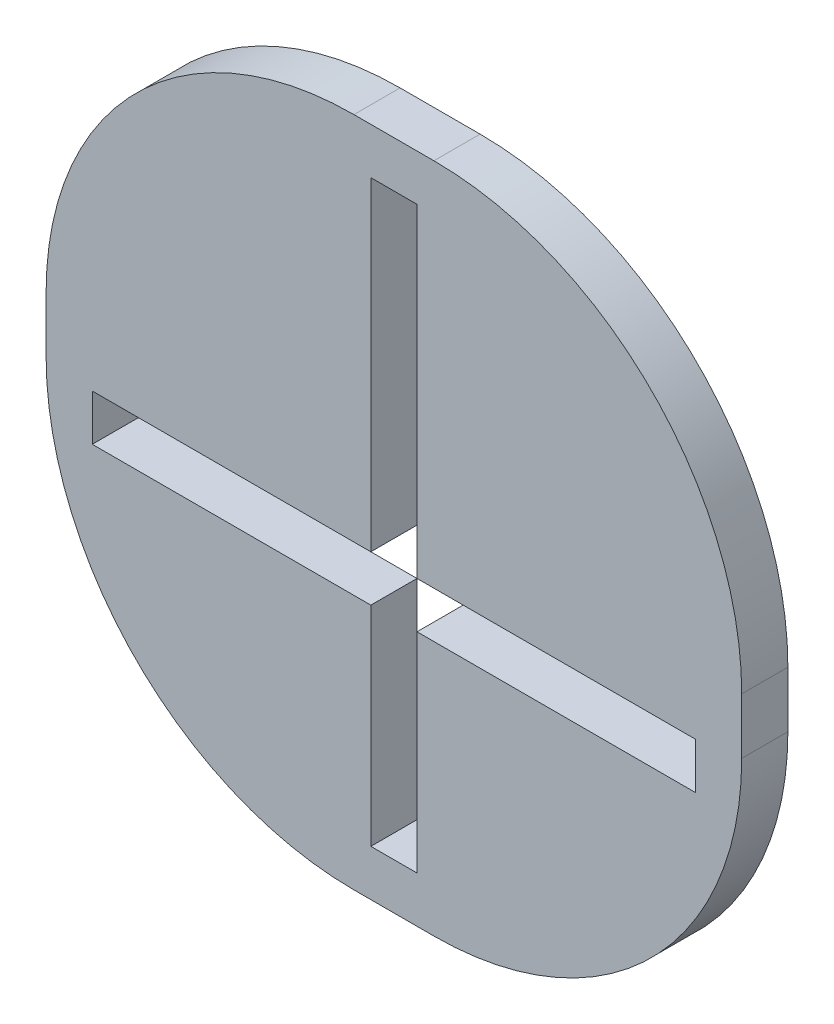
ISO-10303-21;
HEADER;
FILE_DESCRIPTION(('STEP AP214'),'2;1');
FILE_NAME('part.step','',(''),(''),'','','');
FILE_SCHEMA(('AUTOMOTIVE_DESIGN { 1 0 10303 214 1 1 1 1 }'));
ENDSEC;
DATA;
#1=APPLICATION_CONTEXT('core data for automotive mechanical design processes');
#2=APPLICATION_PROTOCOL_DEFINITION('international standard','automotive_design',2000,#1);
#3=PRODUCT_CONTEXT('',#1,'mechanical');
#4=PRODUCT('Part','Part','',(#3));
#5=PRODUCT_RELATED_PRODUCT_CATEGORY('part','',(#4));
#6=PRODUCT_DEFINITION_FORMATION('','',#4);
#7=PRODUCT_DEFINITION_CONTEXT('part definition',#1,'design');
#8=PRODUCT_DEFINITION('design','',#6,#7);
#9=PRODUCT_DEFINITION_SHAPE('','',#8);
#10=(LENGTH_UNIT() NAMED_UNIT(*) SI_UNIT(.MILLI.,.METRE.));
#11=(NAMED_UNIT(*) PLANE_ANGLE_UNIT() SI_UNIT($,.RADIAN.));
#12=(NAMED_UNIT(*) SI_UNIT($,.STERADIAN.) SOLID_ANGLE_UNIT());
#13=UNCERTAINTY_MEASURE_WITH_UNIT(LENGTH_MEASURE(1.E-05),#10,'distance_accuracy_value','');
#14=(GEOMETRIC_REPRESENTATION_CONTEXT(3) GLOBAL_UNCERTAINTY_ASSIGNED_CONTEXT((#13)) GLOBAL_UNIT_ASSIGNED_CONTEXT((#10,
#11,#12)) REPRESENTATION_CONTEXT('',''));
#15=CARTESIAN_POINT('',(0.,0.,0.));
#16=DIRECTION('',(0.,0.,1.));
#17=DIRECTION('',(1.,0.,0.));
#18=AXIS2_PLACEMENT_3D('',#15,#16,#17);
#19=CARTESIAN_POINT('',(0.,21.815,3.));
#20=DIRECTION('',(0.,-1.,0.));
#21=DIRECTION('',(0.,0.,-1.));
#22=AXIS2_PLACEMENT_3D('',#19,#20,#21);
#23=PLANE('',#22);
#24=DIRECTION('',(-1.,0.,0.));
#25=VECTOR('',#24,1.);
#26=CARTESIAN_POINT('',(0.,21.815,0.));
#27=LINE('',#26,#25);
#28=CARTESIAN_POINT('',(2.6,21.815,0.));
#29=VERTEX_POINT('',#28);
#30=CARTESIAN_POINT('',(-2.60000000000002,21.815,0.));
#31=VERTEX_POINT('',#30);
#32=EDGE_CURVE('E254',#29,#31,#27,.T.);
#33=ORIENTED_EDGE('',*,*,#32,.T.);
#34=DIRECTION('',(0.,0.,-1.));
#35=VECTOR('',#34,1.);
#36=CARTESIAN_POINT('',(-2.60000000000002,21.815,3.));
#37=LINE('',#36,#35);
#38=CARTESIAN_POINT('',(-2.60000000000002,21.815,3.));
#39=VERTEX_POINT('',#38);
#40=EDGE_CURVE('E11',#39,#31,#37,.T.);
#41=ORIENTED_EDGE('',*,*,#40,.F.);
#42=DIRECTION('',(-1.,0.,0.));
#43=VECTOR('',#42,1.);
#44=CARTESIAN_POINT('',(0.,21.815,3.));
#45=LINE('',#44,#43);
#46=CARTESIAN_POINT('',(2.6,21.815,3.));
#47=VERTEX_POINT('',#46);
#48=EDGE_CURVE('E405',#47,#39,#45,.T.);
#49=ORIENTED_EDGE('',*,*,#48,.F.);
#50=DIRECTION('',(0.,0.,-1.));
#51=VECTOR('',#50,1.);
#52=CARTESIAN_POINT('',(2.6,21.815,3.));
#53=LINE('',#52,#51);
#54=EDGE_CURVE('E281',#47,#29,#53,.T.);
#55=ORIENTED_EDGE('',*,*,#54,.T.);
#56=EDGE_LOOP('',(#33,#41,#49,#55));
#57=FACE_BOUND('',#56,.T.);
#58=ADVANCED_FACE('F45',(#57),#23,.F.);
#59=CARTESIAN_POINT('',(-2.60000000000002,1.81500000000003,3.));
#60=DIRECTION('',(0.,0.,-1.));
#61=DIRECTION('',(-1.,0.,0.));
#62=AXIS2_PLACEMENT_3D('',#59,#60,#61);
#63=CYLINDRICAL_SURFACE('',#62,20.);
#64=CARTESIAN_POINT('',(-2.60000000000002,1.81500000000003,0.));
#65=DIRECTION('',(0.,0.,1.));
#66=DIRECTION('',(1.,0.,0.));
#67=AXIS2_PLACEMENT_3D('',#64,#65,#66);
#68=CIRCLE('',#67,20.);
#69=CARTESIAN_POINT('',(-22.6,1.81500000000002,0.));
#70=VERTEX_POINT('',#69);
#71=EDGE_CURVE('E258',#31,#70,#68,.T.);
#72=ORIENTED_EDGE('',*,*,#71,.T.);
#73=DIRECTION('',(0.,0.,-1.));
#74=VECTOR('',#73,1.);
#75=CARTESIAN_POINT('',(-22.6,1.81500000000002,3.));
#76=LINE('',#75,#74);
#77=CARTESIAN_POINT('',(-22.6,1.81500000000002,3.));
#78=VERTEX_POINT('',#77);
#79=EDGE_CURVE('E56',#78,#70,#76,.T.);
#80=ORIENTED_EDGE('',*,*,#79,.F.);
#81=CARTESIAN_POINT('',(-2.60000000000002,1.81500000000003,3.));
#82=DIRECTION('',(0.,0.,1.));
#83=DIRECTION('',(1.,0.,0.));
#84=AXIS2_PLACEMENT_3D('',#81,#82,#83);
#85=CIRCLE('',#84,20.);
#86=EDGE_CURVE('E408',#39,#78,#85,.T.);
#87=ORIENTED_EDGE('',*,*,#86,.F.);
#88=ORIENTED_EDGE('',*,*,#40,.T.);
#89=EDGE_LOOP('',(#72,#80,#87,#88));
#90=FACE_BOUND('',#89,.T.);
#91=ADVANCED_FACE('F440',(#90),#63,.T.);
#92=CARTESIAN_POINT('',(-22.6,0.,3.));
#93=DIRECTION('',(-1.,0.,0.));
#94=DIRECTION('',(0.,0.,1.));
#95=AXIS2_PLACEMENT_3D('',#92,#93,#94);
#96=PLANE('',#95);
#97=DIRECTION('',(0.,1.,0.));
#98=VECTOR('',#97,1.);
#99=CARTESIAN_POINT('',(-22.6,0.,0.));
#100=LINE('',#99,#98);
#101=CARTESIAN_POINT('',(-22.6,-1.81500000000002,0.));
#102=VERTEX_POINT('',#101);
#103=EDGE_CURVE('E262',#102,#70,#100,.T.);
#104=ORIENTED_EDGE('',*,*,#103,.F.);
#105=DIRECTION('',(0.,0.,-1.));
#106=VECTOR('',#105,1.);
#107=CARTESIAN_POINT('',(-22.6,-1.81500000000002,3.));
#108=LINE('',#107,#106);
#109=CARTESIAN_POINT('',(-22.6,-1.81500000000002,3.));
#110=VERTEX_POINT('',#109);
#111=EDGE_CURVE('E291',#110,#102,#108,.T.);
#112=ORIENTED_EDGE('',*,*,#111,.F.);
#113=DIRECTION('',(0.,1.,0.));
#114=VECTOR('',#113,1.);
#115=CARTESIAN_POINT('',(-22.6,0.,3.));
#116=LINE('',#115,#114);
#117=EDGE_CURVE('E411',#110,#78,#116,.T.);
#118=ORIENTED_EDGE('',*,*,#117,.T.);
#119=ORIENTED_EDGE('',*,*,#79,.T.);
#120=EDGE_LOOP('',(#104,#112,#118,#119));
#121=FACE_BOUND('',#120,.T.);
#122=ADVANCED_FACE('F445',(#121),#96,.T.);
#123=CARTESIAN_POINT('',(-2.60000000000002,-1.81500000000001,3.));
#124=DIRECTION('',(0.,0.,-1.));
#125=DIRECTION('',(-1.,0.,0.));
#126=AXIS2_PLACEMENT_3D('',#123,#124,#125);
#127=CYLINDRICAL_SURFACE('',#126,20.);
#128=CARTESIAN_POINT('',(-2.60000000000002,-1.81500000000001,0.));
#129=DIRECTION('',(0.,0.,1.));
#130=DIRECTION('',(1.,0.,0.));
#131=AXIS2_PLACEMENT_3D('',#128,#129,#130);
#132=CIRCLE('',#131,20.);
#133=CARTESIAN_POINT('',(-2.60000000000002,-21.815,0.));
#134=VERTEX_POINT('',#133);
#135=EDGE_CURVE('E266',#134,#102,#132,.F.);
#136=ORIENTED_EDGE('',*,*,#135,.F.);
#137=DIRECTION('',(0.,0.,-1.));
#138=VECTOR('',#137,1.);
#139=CARTESIAN_POINT('',(-2.60000000000002,-21.815,3.));
#140=LINE('',#139,#138);
#141=CARTESIAN_POINT('',(-2.60000000000002,-21.815,3.));
#142=VERTEX_POINT('',#141);
#143=EDGE_CURVE('E288',#142,#134,#140,.T.);
#144=ORIENTED_EDGE('',*,*,#143,.F.);
#145=CARTESIAN_POINT('',(-2.60000000000002,-1.81500000000001,3.));
#146=DIRECTION('',(0.,0.,1.));
#147=DIRECTION('',(1.,0.,0.));
#148=AXIS2_PLACEMENT_3D('',#145,#146,#147);
#149=CIRCLE('',#148,20.);
#150=EDGE_CURVE('E415',#142,#110,#149,.F.);
#151=ORIENTED_EDGE('',*,*,#150,.T.);
#152=ORIENTED_EDGE('',*,*,#111,.T.);
#153=EDGE_LOOP('',(#136,#144,#151,#152));
#154=FACE_BOUND('',#153,.T.);
#155=ADVANCED_FACE('F608',(#154),#127,.T.);
#156=CARTESIAN_POINT('',(0.,-21.815,3.));
#157=DIRECTION('',(0.,-1.,0.));
#158=DIRECTION('',(0.,0.,-1.));
#159=AXIS2_PLACEMENT_3D('',#156,#157,#158);
#160=PLANE('',#159);
#161=DIRECTION('',(-1.,0.,0.));
#162=VECTOR('',#161,1.);
#163=CARTESIAN_POINT('',(0.,-21.815,0.));
#164=LINE('',#163,#162);
#165=CARTESIAN_POINT('',(2.60000000000002,-21.815,0.));
#166=VERTEX_POINT('',#165);
#167=EDGE_CURVE('E270',#166,#134,#164,.T.);
#168=ORIENTED_EDGE('',*,*,#167,.F.);
#169=DIRECTION('',(0.,0.,-1.));
#170=VECTOR('',#169,1.);
#171=CARTESIAN_POINT('',(2.60000000000002,-21.815,3.));
#172=LINE('',#171,#170);
#173=CARTESIAN_POINT('',(2.60000000000002,-21.815,3.));
#174=VERTEX_POINT('',#173);
#175=EDGE_CURVE('E212',#174,#166,#172,.T.);
#176=ORIENTED_EDGE('',*,*,#175,.F.);
#177=DIRECTION('',(-1.,0.,0.));
#178=VECTOR('',#177,1.);
#179=CARTESIAN_POINT('',(0.,-21.815,3.));
#180=LINE('',#179,#178);
#181=EDGE_CURVE('E203',#174,#142,#180,.T.);
#182=ORIENTED_EDGE('',*,*,#181,.T.);
#183=ORIENTED_EDGE('',*,*,#143,.T.);
#184=EDGE_LOOP('',(#168,#176,#182,#183));
#185=FACE_BOUND('',#184,.T.);
#186=ADVANCED_FACE('F421',(#185),#160,.T.);
#187=CARTESIAN_POINT('',(2.6,-1.815,3.));
#188=DIRECTION('',(0.,0.,-1.));
#189=DIRECTION('',(-1.,0.,0.));
#190=AXIS2_PLACEMENT_3D('',#187,#188,#189);
#191=CYLINDRICAL_SURFACE('',#190,20.);
#192=CARTESIAN_POINT('',(2.6,-1.815,0.));
#193=DIRECTION('',(0.,0.,1.));
#194=DIRECTION('',(1.,0.,0.));
#195=AXIS2_PLACEMENT_3D('',#192,#193,#194);
#196=CIRCLE('',#195,20.);
#197=CARTESIAN_POINT('',(22.6,-1.815,0.));
#198=VERTEX_POINT('',#197);
#199=EDGE_CURVE('E210',#166,#198,#196,.T.);
#200=ORIENTED_EDGE('',*,*,#199,.T.);
#201=DIRECTION('',(0.,0.,-1.));
#202=VECTOR('',#201,1.);
#203=CARTESIAN_POINT('',(22.6,-1.815,3.));
#204=LINE('',#203,#202);
#205=CARTESIAN_POINT('',(22.6,-1.815,3.));
#206=VERTEX_POINT('',#205);
#207=EDGE_CURVE('E207',#206,#198,#204,.T.);
#208=ORIENTED_EDGE('',*,*,#207,.F.);
#209=CARTESIAN_POINT('',(2.6,-1.815,3.));
#210=DIRECTION('',(0.,0.,1.));
#211=DIRECTION('',(1.,0.,0.));
#212=AXIS2_PLACEMENT_3D('',#209,#210,#211);
#213=CIRCLE('',#212,20.);
#214=EDGE_CURVE('E196',#174,#206,#213,.T.);
#215=ORIENTED_EDGE('',*,*,#214,.F.);
#216=ORIENTED_EDGE('',*,*,#175,.T.);
#217=EDGE_LOOP('',(#200,#208,#215,#216));
#218=FACE_BOUND('',#217,.T.);
#219=ADVANCED_FACE('F208',(#218),#191,.T.);
#220=CARTESIAN_POINT('',(22.6,0.,3.));
#221=DIRECTION('',(-1.,0.,0.));
#222=DIRECTION('',(0.,0.,1.));
#223=AXIS2_PLACEMENT_3D('',#220,#221,#222);
#224=PLANE('',#223);
#225=DIRECTION('',(0.,1.,0.));
#226=VECTOR('',#225,1.);
#227=CARTESIAN_POINT('',(22.6,0.,0.));
#228=LINE('',#227,#226);
#229=CARTESIAN_POINT('',(22.6,1.81500000000003,0.));
#230=VERTEX_POINT('',#229);
#231=EDGE_CURVE('E130',#198,#230,#228,.T.);
#232=ORIENTED_EDGE('',*,*,#231,.T.);
#233=DIRECTION('',(0.,0.,-1.));
#234=VECTOR('',#233,1.);
#235=CARTESIAN_POINT('',(22.6,1.81500000000003,3.));
#236=LINE('',#235,#234);
#237=CARTESIAN_POINT('',(22.6,1.81500000000003,3.));
#238=VERTEX_POINT('',#237);
#239=EDGE_CURVE('E213',#238,#230,#236,.T.);
#240=ORIENTED_EDGE('',*,*,#239,.F.);
#241=DIRECTION('',(0.,1.,0.));
#242=VECTOR('',#241,1.);
#243=CARTESIAN_POINT('',(22.6,0.,3.));
#244=LINE('',#243,#242);
#245=EDGE_CURVE('E200',#206,#238,#244,.T.);
#246=ORIENTED_EDGE('',*,*,#245,.F.);
#247=ORIENTED_EDGE('',*,*,#207,.T.);
#248=EDGE_LOOP('',(#232,#240,#246,#247));
#249=FACE_BOUND('',#248,.T.);
#250=ADVANCED_FACE('F215',(#249),#224,.F.);
#251=CARTESIAN_POINT('',(0.,18.815,3.));
#252=DIRECTION('',(0.,1.,0.));
#253=DIRECTION('',(0.,0.,1.));
#254=AXIS2_PLACEMENT_3D('',#251,#252,#253);
#255=PLANE('',#254);
#256=DIRECTION('',(1.,0.,0.));
#257=VECTOR('',#256,1.);
#258=CARTESIAN_POINT('',(0.,18.815,0.));
#259=LINE('',#258,#257);
#260=CARTESIAN_POINT('',(-1.5,18.815,0.));
#261=VERTEX_POINT('',#260);
#262=CARTESIAN_POINT('',(1.5,18.815,0.));
#263=VERTEX_POINT('',#262);
#264=EDGE_CURVE('E223',#261,#263,#259,.T.);
#265=ORIENTED_EDGE('',*,*,#264,.T.);
#266=DIRECTION('',(0.,0.,-1.));
#267=VECTOR('',#266,1.);
#268=CARTESIAN_POINT('',(1.5,18.815,3.));
#269=LINE('',#268,#267);
#270=CARTESIAN_POINT('',(1.5,18.815,3.));
#271=VERTEX_POINT('',#270);
#272=EDGE_CURVE('E49',#271,#263,#269,.T.);
#273=ORIENTED_EDGE('',*,*,#272,.F.);
#274=DIRECTION('',(1.,0.,0.));
#275=VECTOR('',#274,1.);
#276=CARTESIAN_POINT('',(0.,18.815,3.));
#277=LINE('',#276,#275);
#278=CARTESIAN_POINT('',(-1.5,18.815,3.));
#279=VERTEX_POINT('',#278);
#280=EDGE_CURVE('E280',#279,#271,#277,.T.);
#281=ORIENTED_EDGE('',*,*,#280,.F.);
#282=DIRECTION('',(0.,0.,-1.));
#283=VECTOR('',#282,1.);
#284=CARTESIAN_POINT('',(-1.5,18.815,3.));
#285=LINE('',#284,#283);
#286=EDGE_CURVE('E219',#279,#261,#285,.T.);
#287=ORIENTED_EDGE('',*,*,#286,.T.);
#288=EDGE_LOOP('',(#265,#273,#281,#287));
#289=FACE_BOUND('',#288,.T.);
#290=ADVANCED_FACE('F47',(#289),#255,.F.);
#291=CARTESIAN_POINT('',(1.5,0.,3.));
#292=DIRECTION('',(1.,0.,0.));
#293=DIRECTION('',(0.,0.,-1.));
#294=AXIS2_PLACEMENT_3D('',#291,#292,#293);
#295=PLANE('',#294);
#296=DIRECTION('',(0.,-1.,0.));
#297=VECTOR('',#296,1.);
#298=CARTESIAN_POINT('',(1.5,0.,0.));
#299=LINE('',#298,#297);
#300=CARTESIAN_POINT('',(1.5,-2.24000000000001,0.));
#301=VERTEX_POINT('',#300);
#302=EDGE_CURVE('E227',#263,#301,#299,.T.);
#303=ORIENTED_EDGE('',*,*,#302,.T.);
#304=DIRECTION('',(0.,0.,-1.));
#305=VECTOR('',#304,1.);
#306=CARTESIAN_POINT('',(1.5,-2.24000000000001,3.));
#307=LINE('',#306,#305);
#308=CARTESIAN_POINT('',(1.5,-2.24000000000001,3.));
#309=VERTEX_POINT('',#308);
#310=EDGE_CURVE('E329',#309,#301,#307,.T.);
#311=ORIENTED_EDGE('',*,*,#310,.F.);
#312=DIRECTION('',(0.,-1.,0.));
#313=VECTOR('',#312,1.);
#314=CARTESIAN_POINT('',(1.5,0.,3.));
#315=LINE('',#314,#313);
#316=EDGE_CURVE('E145',#271,#309,#315,.T.);
#317=ORIENTED_EDGE('',*,*,#316,.F.);
#318=ORIENTED_EDGE('',*,*,#272,.T.);
#319=EDGE_LOOP('',(#303,#311,#317,#318));
#320=FACE_BOUND('',#319,.T.);
#321=ADVANCED_FACE('F337',(#320),#295,.F.);
#322=CARTESIAN_POINT('',(0.,-2.24000000000001,3.));
#323=DIRECTION('',(0.,1.,0.));
#324=DIRECTION('',(0.,0.,1.));
#325=AXIS2_PLACEMENT_3D('',#322,#323,#324);
#326=PLANE('',#325);
#327=DIRECTION('',(1.,0.,0.));
#328=VECTOR('',#327,1.);
#329=CARTESIAN_POINT('',(0.,-2.24000000000001,0.));
#330=LINE('',#329,#328);
#331=CARTESIAN_POINT('',(19.6,-2.24000000000001,0.));
#332=VERTEX_POINT('',#331);
#333=EDGE_CURVE('E230',#301,#332,#330,.T.);
#334=ORIENTED_EDGE('',*,*,#333,.T.);
#335=DIRECTION('',(0.,0.,-1.));
#336=VECTOR('',#335,1.);
#337=CARTESIAN_POINT('',(19.6,-2.24000000000001,3.));
#338=LINE('',#337,#336);
#339=CARTESIAN_POINT('',(19.6,-2.24000000000001,3.));
#340=VERTEX_POINT('',#339);
#341=EDGE_CURVE('E326',#340,#332,#338,.T.);
#342=ORIENTED_EDGE('',*,*,#341,.F.);
#343=DIRECTION('',(1.,0.,0.));
#344=VECTOR('',#343,1.);
#345=CARTESIAN_POINT('',(0.,-2.24000000000001,3.));
#346=LINE('',#345,#344);
#347=EDGE_CURVE('E477',#309,#340,#346,.T.);
#348=ORIENTED_EDGE('',*,*,#347,.F.);
#349=ORIENTED_EDGE('',*,*,#310,.T.);
#350=EDGE_LOOP('',(#334,#342,#348,#349));
#351=FACE_BOUND('',#350,.T.);
#352=ADVANCED_FACE('F452',(#351),#326,.F.);
#353=CARTESIAN_POINT('',(19.6,0.,3.));
#354=DIRECTION('',(1.,0.,0.));
#355=DIRECTION('',(0.,1.,0.));
#356=AXIS2_PLACEMENT_3D('',#353,#354,#355);
#357=PLANE('',#356);
#358=DIRECTION('',(0.,-1.,0.));
#359=VECTOR('',#358,1.);
#360=CARTESIAN_POINT('',(19.6,0.,0.));
#361=LINE('',#360,#359);
#362=CARTESIAN_POINT('',(19.6,-5.24000000000001,0.));
#363=VERTEX_POINT('',#362);
#364=EDGE_CURVE('E234',#332,#363,#361,.T.);
#365=ORIENTED_EDGE('',*,*,#364,.T.);
#366=DIRECTION('',(0.,0.,-1.));
#367=VECTOR('',#366,1.);
#368=CARTESIAN_POINT('',(19.6,-5.24000000000001,3.));
#369=LINE('',#368,#367);
#370=CARTESIAN_POINT('',(19.6,-5.24000000000001,3.));
#371=VERTEX_POINT('',#370);
#372=EDGE_CURVE('E322',#371,#363,#369,.T.);
#373=ORIENTED_EDGE('',*,*,#372,.F.);
#374=DIRECTION('',(0.,-1.,0.));
#375=VECTOR('',#374,1.);
#376=CARTESIAN_POINT('',(19.6,0.,3.));
#377=LINE('',#376,#375);
#378=EDGE_CURVE('E475',#340,#371,#377,.T.);
#379=ORIENTED_EDGE('',*,*,#378,.F.);
#380=ORIENTED_EDGE('',*,*,#341,.T.);
#381=EDGE_LOOP('',(#365,#373,#379,#380));
#382=FACE_BOUND('',#381,.T.);
#383=ADVANCED_FACE('F461',(#382),#357,.F.);
#384=CARTESIAN_POINT('',(0.,-5.24000000000001,3.));
#385=DIRECTION('',(0.,-1.,0.));
#386=DIRECTION('',(0.,0.,-1.));
#387=AXIS2_PLACEMENT_3D('',#384,#385,#386);
#388=PLANE('',#387);
#389=DIRECTION('',(-1.,0.,0.));
#390=VECTOR('',#389,1.);
#391=CARTESIAN_POINT('',(0.,-5.24000000000001,0.));
#392=LINE('',#391,#390);
#393=CARTESIAN_POINT('',(1.5,-5.24000000000001,0.));
#394=VERTEX_POINT('',#393);
#395=EDGE_CURVE('E238',#363,#394,#392,.T.);
#396=ORIENTED_EDGE('',*,*,#395,.T.);
#397=DIRECTION('',(0.,0.,-1.));
#398=VECTOR('',#397,1.);
#399=CARTESIAN_POINT('',(1.5,-5.24000000000001,3.));
#400=LINE('',#399,#398);
#401=CARTESIAN_POINT('',(1.5,-5.24000000000001,3.));
#402=VERTEX_POINT('',#401);
#403=EDGE_CURVE('E318',#402,#394,#400,.T.);
#404=ORIENTED_EDGE('',*,*,#403,.F.);
#405=DIRECTION('',(-1.,0.,0.));
#406=VECTOR('',#405,1.);
#407=CARTESIAN_POINT('',(0.,-5.24000000000001,3.));
#408=LINE('',#407,#406);
#409=EDGE_CURVE('E397',#371,#402,#408,.T.);
#410=ORIENTED_EDGE('',*,*,#409,.F.);
#411=ORIENTED_EDGE('',*,*,#372,.T.);
#412=EDGE_LOOP('',(#396,#404,#410,#411));
#413=FACE_BOUND('',#412,.T.);
#414=ADVANCED_FACE('F457',(#413),#388,.F.);
#415=CARTESIAN_POINT('',(1.5,-18.815,0.));
#416=VERTEX_POINT('',#415);
#417=EDGE_CURVE('E231',#394,#416,#299,.T.);
#418=ORIENTED_EDGE('',*,*,#417,.T.);
#419=DIRECTION('',(0.,0.,-1.));
#420=VECTOR('',#419,1.);
#421=CARTESIAN_POINT('',(1.5,-18.815,3.));
#422=LINE('',#421,#420);
#423=CARTESIAN_POINT('',(1.5,-18.815,3.));
#424=VERTEX_POINT('',#423);
#425=EDGE_CURVE('E315',#424,#416,#422,.T.);
#426=ORIENTED_EDGE('',*,*,#425,.F.);
#427=EDGE_CURVE('E391',#402,#424,#315,.T.);
#428=ORIENTED_EDGE('',*,*,#427,.F.);
#429=ORIENTED_EDGE('',*,*,#403,.T.);
#430=EDGE_LOOP('',(#418,#426,#428,#429));
#431=FACE_BOUND('',#430,.T.);
#432=ADVANCED_FACE('F377',(#431),#295,.F.);
#433=CARTESIAN_POINT('',(0.,-18.815,3.));
#434=DIRECTION('',(0.,1.,0.));
#435=DIRECTION('',(0.,0.,1.));
#436=AXIS2_PLACEMENT_3D('',#433,#434,#435);
#437=PLANE('',#436);
#438=DIRECTION('',(1.,0.,0.));
#439=VECTOR('',#438,1.);
#440=CARTESIAN_POINT('',(0.,-18.815,0.));
#441=LINE('',#440,#439);
#442=CARTESIAN_POINT('',(-1.5,-18.815,0.));
#443=VERTEX_POINT('',#442);
#444=EDGE_CURVE('E242',#443,#416,#441,.T.);
#445=ORIENTED_EDGE('',*,*,#444,.F.);
#446=DIRECTION('',(0.,0.,-1.));
#447=VECTOR('',#446,1.);
#448=CARTESIAN_POINT('',(-1.5,-18.815,3.));
#449=LINE('',#448,#447);
#450=CARTESIAN_POINT('',(-1.5,-18.815,3.));
#451=VERTEX_POINT('',#450);
#452=EDGE_CURVE('E312',#451,#443,#449,.T.);
#453=ORIENTED_EDGE('',*,*,#452,.F.);
#454=DIRECTION('',(1.,0.,0.));
#455=VECTOR('',#454,1.);
#456=CARTESIAN_POINT('',(0.,-18.815,3.));
#457=LINE('',#456,#455);
#458=EDGE_CURVE('E386',#451,#424,#457,.T.);
#459=ORIENTED_EDGE('',*,*,#458,.T.);
#460=ORIENTED_EDGE('',*,*,#425,.T.);
#461=EDGE_LOOP('',(#445,#453,#459,#460));
#462=FACE_BOUND('',#461,.T.);
#463=ADVANCED_FACE('F384',(#462),#437,.T.);
#464=CARTESIAN_POINT('',(-1.5,0.,3.));
#465=DIRECTION('',(1.,0.,0.));
#466=DIRECTION('',(0.,0.,-1.));
#467=AXIS2_PLACEMENT_3D('',#464,#465,#466);
#468=PLANE('',#467);
#469=DIRECTION('',(0.,-1.,0.));
#470=VECTOR('',#469,1.);
#471=CARTESIAN_POINT('',(-1.5,0.,0.));
#472=LINE('',#471,#470);
#473=CARTESIAN_POINT('',(-1.5,-5.24000000000001,0.));
#474=VERTEX_POINT('',#473);
#475=EDGE_CURVE('E246',#474,#443,#472,.T.);
#476=ORIENTED_EDGE('',*,*,#475,.F.);
#477=DIRECTION('',(0.,0.,-1.));
#478=VECTOR('',#477,1.);
#479=CARTESIAN_POINT('',(-1.5,-5.24000000000001,3.));
#480=LINE('',#479,#478);
#481=CARTESIAN_POINT('',(-1.5,-5.24000000000001,3.));
#482=VERTEX_POINT('',#481);
#483=EDGE_CURVE('E309',#482,#474,#480,.T.);
#484=ORIENTED_EDGE('',*,*,#483,.F.);
#485=DIRECTION('',(0.,-1.,0.));
#486=VECTOR('',#485,1.);
#487=CARTESIAN_POINT('',(-1.5,0.,3.));
#488=LINE('',#487,#486);
#489=EDGE_CURVE('E390',#482,#451,#488,.T.);
#490=ORIENTED_EDGE('',*,*,#489,.T.);
#491=ORIENTED_EDGE('',*,*,#452,.T.);
#492=EDGE_LOOP('',(#476,#484,#490,#491));
#493=FACE_BOUND('',#492,.T.);
#494=ADVANCED_FACE('F436',(#493),#468,.T.);
#495=CARTESIAN_POINT('',(-19.6,-5.24000000000001,0.));
#496=VERTEX_POINT('',#495);
#497=EDGE_CURVE('E241',#474,#496,#392,.T.);
#498=ORIENTED_EDGE('',*,*,#497,.T.);
#499=DIRECTION('',(0.,0.,-1.));
#500=VECTOR('',#499,1.);
#501=CARTESIAN_POINT('',(-19.6,-5.24000000000001,3.));
#502=LINE('',#501,#500);
#503=CARTESIAN_POINT('',(-19.6,-5.24000000000001,3.));
#504=VERTEX_POINT('',#503);
#505=EDGE_CURVE('E305',#504,#496,#502,.T.);
#506=ORIENTED_EDGE('',*,*,#505,.F.);
#507=EDGE_CURVE('E369',#482,#504,#408,.T.);
#508=ORIENTED_EDGE('',*,*,#507,.F.);
#509=ORIENTED_EDGE('',*,*,#483,.T.);
#510=EDGE_LOOP('',(#498,#506,#508,#509));
#511=FACE_BOUND('',#510,.T.);
#512=ADVANCED_FACE('F368',(#511),#388,.F.);
#513=CARTESIAN_POINT('',(-19.6,0.,3.));
#514=DIRECTION('',(-1.,0.,0.));
#515=DIRECTION('',(0.,-1.,0.));
#516=AXIS2_PLACEMENT_3D('',#513,#514,#515);
#517=PLANE('',#516);
#518=DIRECTION('',(0.,1.,0.));
#519=VECTOR('',#518,1.);
#520=CARTESIAN_POINT('',(-19.6,0.,0.));
#521=LINE('',#520,#519);
#522=CARTESIAN_POINT('',(-19.6,-2.24000000000001,0.));
#523=VERTEX_POINT('',#522);
#524=EDGE_CURVE('E251',#496,#523,#521,.T.);
#525=ORIENTED_EDGE('',*,*,#524,.T.);
#526=DIRECTION('',(0.,0.,-1.));
#527=VECTOR('',#526,1.);
#528=CARTESIAN_POINT('',(-19.6,-2.24000000000001,3.));
#529=LINE('',#528,#527);
#530=CARTESIAN_POINT('',(-19.6,-2.24000000000001,3.));
#531=VERTEX_POINT('',#530);
#532=EDGE_CURVE('E301',#531,#523,#529,.T.);
#533=ORIENTED_EDGE('',*,*,#532,.F.);
#534=DIRECTION('',(0.,1.,0.));
#535=VECTOR('',#534,1.);
#536=CARTESIAN_POINT('',(-19.6,0.,3.));
#537=LINE('',#536,#535);
#538=EDGE_CURVE('E365',#504,#531,#537,.T.);
#539=ORIENTED_EDGE('',*,*,#538,.F.);
#540=ORIENTED_EDGE('',*,*,#505,.T.);
#541=EDGE_LOOP('',(#525,#533,#539,#540));
#542=FACE_BOUND('',#541,.T.);
#543=ADVANCED_FACE('F362',(#542),#517,.F.);
#544=CARTESIAN_POINT('',(-1.5,-2.24000000000001,0.));
#545=VERTEX_POINT('',#544);
#546=EDGE_CURVE('E235',#523,#545,#330,.T.);
#547=ORIENTED_EDGE('',*,*,#546,.T.);
#548=DIRECTION('',(0.,0.,-1.));
#549=VECTOR('',#548,1.);
#550=CARTESIAN_POINT('',(-1.5,-2.24000000000001,3.));
#551=LINE('',#550,#549);
#552=CARTESIAN_POINT('',(-1.5,-2.24000000000001,3.));
#553=VERTEX_POINT('',#552);
#554=EDGE_CURVE('E298',#553,#545,#551,.T.);
#555=ORIENTED_EDGE('',*,*,#554,.F.);
#556=EDGE_CURVE('E404',#531,#553,#346,.T.);
#557=ORIENTED_EDGE('',*,*,#556,.F.);
#558=ORIENTED_EDGE('',*,*,#532,.T.);
#559=EDGE_LOOP('',(#547,#555,#557,#558));
#560=FACE_BOUND('',#559,.T.);
#561=ADVANCED_FACE('F355',(#560),#326,.F.);
#562=EDGE_CURVE('E250',#261,#545,#472,.T.);
#563=ORIENTED_EDGE('',*,*,#562,.F.);
#564=ORIENTED_EDGE('',*,*,#286,.F.);
#565=EDGE_CURVE('E396',#279,#553,#488,.T.);
#566=ORIENTED_EDGE('',*,*,#565,.T.);
#567=ORIENTED_EDGE('',*,*,#554,.T.);
#568=EDGE_LOOP('',(#563,#564,#566,#567));
#569=FACE_BOUND('',#568,.T.);
#570=ADVANCED_FACE('F348',(#569),#468,.T.);
#571=CARTESIAN_POINT('',(2.6,1.81500000000003,3.));
#572=DIRECTION('',(0.,0.,-1.));
#573=DIRECTION('',(-1.,0.,0.));
#574=AXIS2_PLACEMENT_3D('',#571,#572,#573);
#575=CYLINDRICAL_SURFACE('',#574,20.);
#576=CARTESIAN_POINT('',(2.6,1.81500000000003,0.));
#577=DIRECTION('',(0.,0.,1.));
#578=DIRECTION('',(1.,0.,0.));
#579=AXIS2_PLACEMENT_3D('',#576,#577,#578);
#580=CIRCLE('',#579,20.);
#581=EDGE_CURVE('E136',#230,#29,#580,.T.);
#582=ORIENTED_EDGE('',*,*,#581,.T.);
#583=ORIENTED_EDGE('',*,*,#54,.F.);
#584=CARTESIAN_POINT('',(2.6,1.81500000000003,3.));
#585=DIRECTION('',(0.,0.,1.));
#586=DIRECTION('',(1.,0.,0.));
#587=AXIS2_PLACEMENT_3D('',#584,#585,#586);
#588=CIRCLE('',#587,20.);
#589=EDGE_CURVE('E65',#238,#47,#588,.T.);
#590=ORIENTED_EDGE('',*,*,#589,.F.);
#591=ORIENTED_EDGE('',*,*,#239,.T.);
#592=EDGE_LOOP('',(#582,#583,#590,#591));
#593=FACE_BOUND('',#592,.T.);
#594=ADVANCED_FACE('F427',(#593),#575,.T.);
#595=CARTESIAN_POINT('',(0.,0.,3.));
#596=DIRECTION('',(0.,0.,1.));
#597=DIRECTION('',(1.,0.,0.));
#598=AXIS2_PLACEMENT_3D('',#595,#596,#597);
#599=PLANE('',#598);
#600=ORIENTED_EDGE('',*,*,#280,.T.);
#601=ORIENTED_EDGE('',*,*,#316,.T.);
#602=ORIENTED_EDGE('',*,*,#347,.T.);
#603=ORIENTED_EDGE('',*,*,#378,.T.);
#604=ORIENTED_EDGE('',*,*,#409,.T.);
#605=ORIENTED_EDGE('',*,*,#427,.T.);
#606=ORIENTED_EDGE('',*,*,#458,.F.);
#607=ORIENTED_EDGE('',*,*,#489,.F.);
#608=ORIENTED_EDGE('',*,*,#507,.T.);
#609=ORIENTED_EDGE('',*,*,#538,.T.);
#610=ORIENTED_EDGE('',*,*,#556,.T.);
#611=ORIENTED_EDGE('',*,*,#565,.F.);
#612=EDGE_LOOP('',(#600,#601,#602,#603,#604,#605,#606,#607,#608,#609,#610,#611));
#613=FACE_BOUND('',#612,.T.);
#614=ORIENTED_EDGE('',*,*,#48,.T.);
#615=ORIENTED_EDGE('',*,*,#86,.T.);
#616=ORIENTED_EDGE('',*,*,#117,.F.);
#617=ORIENTED_EDGE('',*,*,#150,.F.);
#618=ORIENTED_EDGE('',*,*,#181,.F.);
#619=ORIENTED_EDGE('',*,*,#214,.T.);
#620=ORIENTED_EDGE('',*,*,#245,.T.);
#621=ORIENTED_EDGE('',*,*,#589,.T.);
#622=EDGE_LOOP('',(#614,#615,#616,#617,#618,#619,#620,#621));
#623=FACE_BOUND('',#622,.T.);
#624=ADVANCED_FACE('F198',(#613,#623),#599,.T.);
#625=CARTESIAN_POINT('',(0.,0.,0.));
#626=DIRECTION('',(0.,0.,1.));
#627=DIRECTION('',(1.,0.,0.));
#628=AXIS2_PLACEMENT_3D('',#625,#626,#627);
#629=PLANE('',#628);
#630=ORIENTED_EDGE('',*,*,#264,.F.);
#631=ORIENTED_EDGE('',*,*,#562,.T.);
#632=ORIENTED_EDGE('',*,*,#546,.F.);
#633=ORIENTED_EDGE('',*,*,#524,.F.);
#634=ORIENTED_EDGE('',*,*,#497,.F.);
#635=ORIENTED_EDGE('',*,*,#475,.T.);
#636=ORIENTED_EDGE('',*,*,#444,.T.);
#637=ORIENTED_EDGE('',*,*,#417,.F.);
#638=ORIENTED_EDGE('',*,*,#395,.F.);
#639=ORIENTED_EDGE('',*,*,#364,.F.);
#640=ORIENTED_EDGE('',*,*,#333,.F.);
#641=ORIENTED_EDGE('',*,*,#302,.F.);
#642=EDGE_LOOP('',(#630,#631,#632,#633,#634,#635,#636,#637,#638,#639,#640,#641));
#643=FACE_BOUND('',#642,.T.);
#644=ORIENTED_EDGE('',*,*,#32,.F.);
#645=ORIENTED_EDGE('',*,*,#581,.F.);
#646=ORIENTED_EDGE('',*,*,#231,.F.);
#647=ORIENTED_EDGE('',*,*,#199,.F.);
#648=ORIENTED_EDGE('',*,*,#167,.T.);
#649=ORIENTED_EDGE('',*,*,#135,.T.);
#650=ORIENTED_EDGE('',*,*,#103,.T.);
#651=ORIENTED_EDGE('',*,*,#71,.F.);
#652=EDGE_LOOP('',(#644,#645,#646,#647,#648,#649,#650,#651));
#653=FACE_BOUND('',#652,.T.);
#654=ADVANCED_FACE('F344',(#643,#653),#629,.F.);
#655=CLOSED_SHELL('',(#58,#91,#122,#155,#186,#219,#250,#290,#321,#352,#383,#414,#432,#463,#494,
#512,#543,#561,#570,#594,#624,#654));
#656=MANIFOLD_SOLID_BREP('B2',#655);
#657=ADVANCED_BREP_SHAPE_REPRESENTATION('',(#18,#656),#14);
#658=SHAPE_DEFINITION_REPRESENTATION(#9,#657);
ENDSEC;
END-ISO-10303-21;
